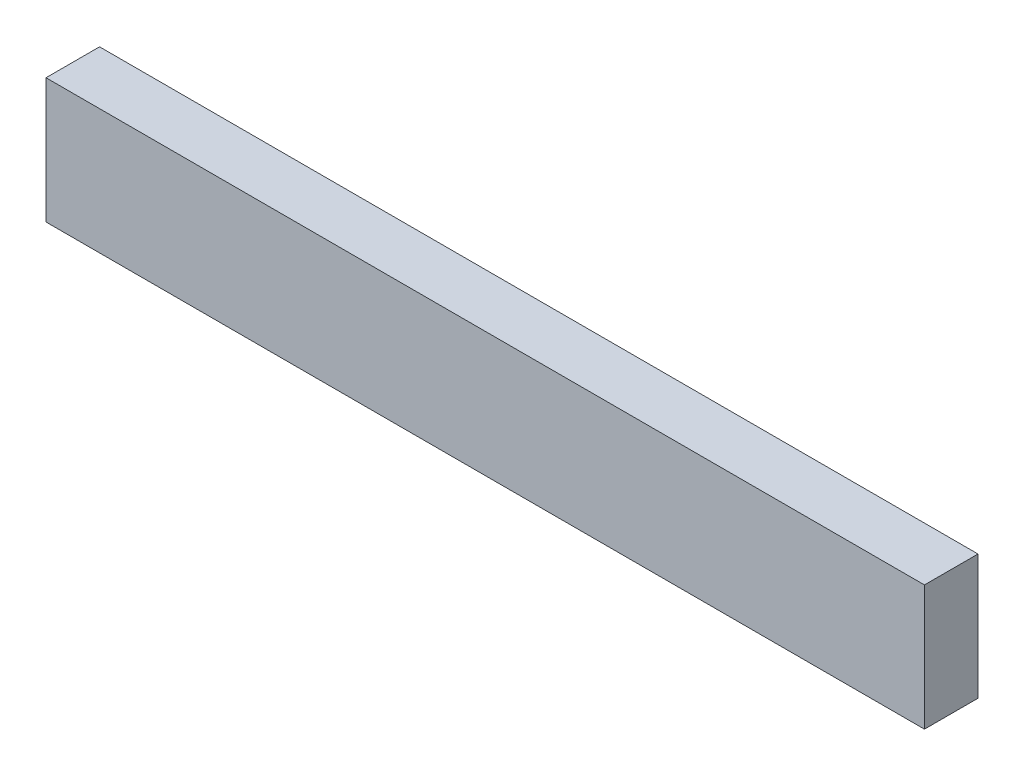
ISO-10303-21;
HEADER;
FILE_DESCRIPTION(('STEP AP214'),'2;1');
FILE_NAME('part.step','',(''),(''),'','','');
FILE_SCHEMA(('AUTOMOTIVE_DESIGN { 1 0 10303 214 1 1 1 1 }'));
ENDSEC;
DATA;
#1=APPLICATION_CONTEXT('core data for automotive mechanical design processes');
#2=APPLICATION_PROTOCOL_DEFINITION('international standard','automotive_design',2000,#1);
#3=PRODUCT_CONTEXT('',#1,'mechanical');
#4=PRODUCT('Part','Part','',(#3));
#5=PRODUCT_RELATED_PRODUCT_CATEGORY('part','',(#4));
#6=PRODUCT_DEFINITION_FORMATION('','',#4);
#7=PRODUCT_DEFINITION_CONTEXT('part definition',#1,'design');
#8=PRODUCT_DEFINITION('design','',#6,#7);
#9=PRODUCT_DEFINITION_SHAPE('','',#8);
#10=(LENGTH_UNIT() NAMED_UNIT(*) SI_UNIT(.MILLI.,.METRE.));
#11=(NAMED_UNIT(*) PLANE_ANGLE_UNIT() SI_UNIT($,.RADIAN.));
#12=(NAMED_UNIT(*) SI_UNIT($,.STERADIAN.) SOLID_ANGLE_UNIT());
#13=UNCERTAINTY_MEASURE_WITH_UNIT(LENGTH_MEASURE(1.E-05),#10,'distance_accuracy_value','');
#14=(GEOMETRIC_REPRESENTATION_CONTEXT(3) GLOBAL_UNCERTAINTY_ASSIGNED_CONTEXT((#13)) GLOBAL_UNIT_ASSIGNED_CONTEXT((#10,
#11,#12)) REPRESENTATION_CONTEXT('',''));
#15=CARTESIAN_POINT('',(0.,0.,0.));
#16=DIRECTION('',(0.,0.,1.));
#17=DIRECTION('',(1.,0.,0.));
#18=AXIS2_PLACEMENT_3D('',#15,#16,#17);
#19=CARTESIAN_POINT('',(0.,88.9,38.1));
#20=DIRECTION('',(1.,0.,0.));
#21=DIRECTION('',(0.,1.,0.));
#22=AXIS2_PLACEMENT_3D('',#19,#20,#21);
#23=PLANE('',#22);
#24=DIRECTION('',(0.,-1.,0.));
#25=VECTOR('',#24,1.);
#26=CARTESIAN_POINT('',(0.,88.9,0.));
#27=LINE('',#26,#25);
#28=CARTESIAN_POINT('',(0.,88.9,0.));
#29=VERTEX_POINT('',#28);
#30=CARTESIAN_POINT('',(0.,0.,0.));
#31=VERTEX_POINT('',#30);
#32=EDGE_CURVE('E107',#29,#31,#27,.T.);
#33=ORIENTED_EDGE('',*,*,#32,.T.);
#34=DIRECTION('',(0.,0.,-1.));
#35=VECTOR('',#34,1.);
#36=CARTESIAN_POINT('',(0.,0.,38.1));
#37=LINE('',#36,#35);
#38=CARTESIAN_POINT('',(0.,0.,38.1));
#39=VERTEX_POINT('',#38);
#40=EDGE_CURVE('E11',#39,#31,#37,.T.);
#41=ORIENTED_EDGE('',*,*,#40,.F.);
#42=DIRECTION('',(0.,-1.,0.));
#43=VECTOR('',#42,1.);
#44=CARTESIAN_POINT('',(0.,88.9,38.1));
#45=LINE('',#44,#43);
#46=CARTESIAN_POINT('',(0.,88.9,38.1));
#47=VERTEX_POINT('',#46);
#48=EDGE_CURVE('E91',#47,#39,#45,.T.);
#49=ORIENTED_EDGE('',*,*,#48,.F.);
#50=DIRECTION('',(0.,0.,-1.));
#51=VECTOR('',#50,1.);
#52=CARTESIAN_POINT('',(0.,88.9,38.1));
#53=LINE('',#52,#51);
#54=EDGE_CURVE('E103',#47,#29,#53,.T.);
#55=ORIENTED_EDGE('',*,*,#54,.T.);
#56=EDGE_LOOP('',(#33,#41,#49,#55));
#57=FACE_BOUND('',#56,.T.);
#58=ADVANCED_FACE('F39',(#57),#23,.F.);
#59=CARTESIAN_POINT('',(0.,0.,38.1));
#60=DIRECTION('',(0.,1.,0.));
#61=DIRECTION('',(0.,0.,1.));
#62=AXIS2_PLACEMENT_3D('',#59,#60,#61);
#63=PLANE('',#62);
#64=DIRECTION('',(1.,0.,0.));
#65=VECTOR('',#64,1.);
#66=CARTESIAN_POINT('',(0.,0.,0.));
#67=LINE('',#66,#65);
#68=CARTESIAN_POINT('',(625.,0.,0.));
#69=VERTEX_POINT('',#68);
#70=EDGE_CURVE('E96',#31,#69,#67,.T.);
#71=ORIENTED_EDGE('',*,*,#70,.T.);
#72=DIRECTION('',(0.,0.,-1.));
#73=VECTOR('',#72,1.);
#74=CARTESIAN_POINT('',(625.,0.,38.1));
#75=LINE('',#74,#73);
#76=CARTESIAN_POINT('',(625.,0.,38.1));
#77=VERTEX_POINT('',#76);
#78=EDGE_CURVE('E48',#77,#69,#75,.T.);
#79=ORIENTED_EDGE('',*,*,#78,.F.);
#80=DIRECTION('',(1.,0.,0.));
#81=VECTOR('',#80,1.);
#82=CARTESIAN_POINT('',(0.,0.,38.1));
#83=LINE('',#82,#81);
#84=EDGE_CURVE('E86',#39,#77,#83,.T.);
#85=ORIENTED_EDGE('',*,*,#84,.F.);
#86=ORIENTED_EDGE('',*,*,#40,.T.);
#87=EDGE_LOOP('',(#71,#79,#85,#86));
#88=FACE_BOUND('',#87,.T.);
#89=ADVANCED_FACE('F95',(#88),#63,.F.);
#90=CARTESIAN_POINT('',(625.,0.,38.1));
#91=DIRECTION('',(-1.,0.,0.));
#92=DIRECTION('',(0.,-1.,0.));
#93=AXIS2_PLACEMENT_3D('',#90,#91,#92);
#94=PLANE('',#93);
#95=DIRECTION('',(0.,1.,0.));
#96=VECTOR('',#95,1.);
#97=CARTESIAN_POINT('',(625.,0.,0.));
#98=LINE('',#97,#96);
#99=CARTESIAN_POINT('',(625.,88.8999999999999,0.));
#100=VERTEX_POINT('',#99);
#101=EDGE_CURVE('E73',#69,#100,#98,.T.);
#102=ORIENTED_EDGE('',*,*,#101,.T.);
#103=DIRECTION('',(0.,0.,-1.));
#104=VECTOR('',#103,1.);
#105=CARTESIAN_POINT('',(625.,88.8999999999999,38.1));
#106=LINE('',#105,#104);
#107=CARTESIAN_POINT('',(625.,88.8999999999999,38.1));
#108=VERTEX_POINT('',#107);
#109=EDGE_CURVE('E98',#108,#100,#106,.T.);
#110=ORIENTED_EDGE('',*,*,#109,.F.);
#111=DIRECTION('',(0.,1.,0.));
#112=VECTOR('',#111,1.);
#113=CARTESIAN_POINT('',(625.,0.,38.1));
#114=LINE('',#113,#112);
#115=EDGE_CURVE('E89',#77,#108,#114,.T.);
#116=ORIENTED_EDGE('',*,*,#115,.F.);
#117=ORIENTED_EDGE('',*,*,#78,.T.);
#118=EDGE_LOOP('',(#102,#110,#116,#117));
#119=FACE_BOUND('',#118,.T.);
#120=ADVANCED_FACE('F99',(#119),#94,.F.);
#121=CARTESIAN_POINT('',(625.,88.8999999999999,38.1));
#122=DIRECTION('',(0.,-1.,0.));
#123=DIRECTION('',(1.,0.,0.));
#124=AXIS2_PLACEMENT_3D('',#121,#122,#123);
#125=PLANE('',#124);
#126=DIRECTION('',(-1.,0.,0.));
#127=VECTOR('',#126,1.);
#128=CARTESIAN_POINT('',(625.,88.8999999999999,0.));
#129=LINE('',#128,#127);
#130=EDGE_CURVE('E79',#100,#29,#129,.T.);
#131=ORIENTED_EDGE('',*,*,#130,.T.);
#132=ORIENTED_EDGE('',*,*,#54,.F.);
#133=DIRECTION('',(-1.,0.,0.));
#134=VECTOR('',#133,1.);
#135=CARTESIAN_POINT('',(625.,88.8999999999999,38.1));
#136=LINE('',#135,#134);
#137=EDGE_CURVE('E56',#108,#47,#136,.T.);
#138=ORIENTED_EDGE('',*,*,#137,.F.);
#139=ORIENTED_EDGE('',*,*,#109,.T.);
#140=EDGE_LOOP('',(#131,#132,#138,#139));
#141=FACE_BOUND('',#140,.T.);
#142=ADVANCED_FACE('F120',(#141),#125,.F.);
#143=CARTESIAN_POINT('',(0.,0.,38.1));
#144=DIRECTION('',(0.,0.,1.));
#145=DIRECTION('',(1.,0.,0.));
#146=AXIS2_PLACEMENT_3D('',#143,#144,#145);
#147=PLANE('',#146);
#148=ORIENTED_EDGE('',*,*,#48,.T.);
#149=ORIENTED_EDGE('',*,*,#84,.T.);
#150=ORIENTED_EDGE('',*,*,#115,.T.);
#151=ORIENTED_EDGE('',*,*,#137,.T.);
#152=EDGE_LOOP('',(#148,#149,#150,#151));
#153=FACE_BOUND('',#152,.T.);
#154=ADVANCED_FACE('F87',(#153),#147,.T.);
#155=CARTESIAN_POINT('',(0.,0.,0.));
#156=DIRECTION('',(0.,0.,1.));
#157=DIRECTION('',(1.,0.,0.));
#158=AXIS2_PLACEMENT_3D('',#155,#156,#157);
#159=PLANE('',#158);
#160=ORIENTED_EDGE('',*,*,#32,.F.);
#161=ORIENTED_EDGE('',*,*,#130,.F.);
#162=ORIENTED_EDGE('',*,*,#101,.F.);
#163=ORIENTED_EDGE('',*,*,#70,.F.);
#164=EDGE_LOOP('',(#160,#161,#162,#163));
#165=FACE_BOUND('',#164,.T.);
#166=ADVANCED_FACE('F123',(#165),#159,.F.);
#167=CLOSED_SHELL('',(#58,#89,#120,#142,#154,#166));
#168=MANIFOLD_SOLID_BREP('B2',#167);
#169=ADVANCED_BREP_SHAPE_REPRESENTATION('',(#18,#168),#14);
#170=SHAPE_DEFINITION_REPRESENTATION(#9,#169);
ENDSEC;
END-ISO-10303-21;
